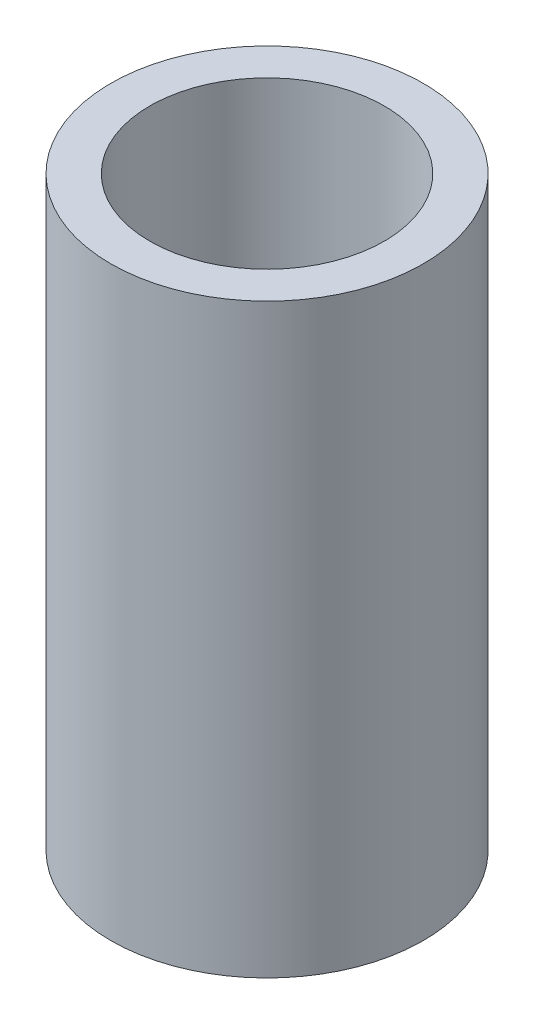
ISO-10303-21;
HEADER;
FILE_DESCRIPTION(('STEP AP214'),'2;1');
FILE_NAME('part.step','',(''),(''),'','','');
FILE_SCHEMA(('AUTOMOTIVE_DESIGN { 1 0 10303 214 1 1 1 1 }'));
ENDSEC;
DATA;
#1=APPLICATION_CONTEXT('core data for automotive mechanical design processes');
#2=APPLICATION_PROTOCOL_DEFINITION('international standard','automotive_design',2000,#1);
#3=PRODUCT_CONTEXT('',#1,'mechanical');
#4=PRODUCT('Part','Part','',(#3));
#5=PRODUCT_RELATED_PRODUCT_CATEGORY('part','',(#4));
#6=PRODUCT_DEFINITION_FORMATION('','',#4);
#7=PRODUCT_DEFINITION_CONTEXT('part definition',#1,'design');
#8=PRODUCT_DEFINITION('design','',#6,#7);
#9=PRODUCT_DEFINITION_SHAPE('','',#8);
#10=(LENGTH_UNIT() NAMED_UNIT(*) SI_UNIT(.MILLI.,.METRE.));
#11=(NAMED_UNIT(*) PLANE_ANGLE_UNIT() SI_UNIT($,.RADIAN.));
#12=(NAMED_UNIT(*) SI_UNIT($,.STERADIAN.) SOLID_ANGLE_UNIT());
#13=UNCERTAINTY_MEASURE_WITH_UNIT(LENGTH_MEASURE(1.E-05),#10,'distance_accuracy_value','');
#14=(GEOMETRIC_REPRESENTATION_CONTEXT(3) GLOBAL_UNCERTAINTY_ASSIGNED_CONTEXT((#13)) GLOBAL_UNIT_ASSIGNED_CONTEXT((#10,
#11,#12)) REPRESENTATION_CONTEXT('',''));
#15=CARTESIAN_POINT('',(0.,0.,0.));
#16=DIRECTION('',(0.,0.,1.));
#17=DIRECTION('',(1.,0.,0.));
#18=AXIS2_PLACEMENT_3D('',#15,#16,#17);
#19=CARTESIAN_POINT('',(0.,15.,0.));
#20=DIRECTION('',(0.,1.,0.));
#21=DIRECTION('',(0.,0.,1.));
#22=AXIS2_PLACEMENT_3D('',#19,#20,#21);
#23=PLANE('',#22);
#24=CARTESIAN_POINT('',(0.,15.,0.));
#25=DIRECTION('',(0.,1.,0.));
#26=DIRECTION('',(0.,0.,1.));
#27=AXIS2_PLACEMENT_3D('',#24,#25,#26);
#28=CIRCLE('',#27,4.);
#29=CARTESIAN_POINT('',(0.,15.,4.));
#30=VERTEX_POINT('',#29);
#31=EDGE_CURVE('E10',#30,#30,#28,.T.);
#32=ORIENTED_EDGE('',*,*,#31,.T.);
#33=EDGE_LOOP('',(#32));
#34=FACE_BOUND('',#33,.T.);
#35=CARTESIAN_POINT('',(0.,15.,0.));
#36=DIRECTION('',(0.,1.,0.));
#37=DIRECTION('',(0.,0.,1.));
#38=AXIS2_PLACEMENT_3D('',#35,#36,#37);
#39=CIRCLE('',#38,3.);
#40=CARTESIAN_POINT('',(0.,15.,3.));
#41=VERTEX_POINT('',#40);
#42=EDGE_CURVE('E44',#41,#41,#39,.T.);
#43=ORIENTED_EDGE('',*,*,#42,.F.);
#44=EDGE_LOOP('',(#43));
#45=FACE_BOUND('',#44,.T.);
#46=ADVANCED_FACE('F33',(#34,#45),#23,.T.);
#47=CARTESIAN_POINT('',(0.,0.,0.));
#48=DIRECTION('',(0.,1.,0.));
#49=DIRECTION('',(0.,0.,1.));
#50=AXIS2_PLACEMENT_3D('',#47,#48,#49);
#51=PLANE('',#50);
#52=CARTESIAN_POINT('',(0.,0.,0.));
#53=DIRECTION('',(0.,1.,0.));
#54=DIRECTION('',(0.,0.,1.));
#55=AXIS2_PLACEMENT_3D('',#52,#53,#54);
#56=CIRCLE('',#55,4.);
#57=CARTESIAN_POINT('',(0.,0.,4.));
#58=VERTEX_POINT('',#57);
#59=EDGE_CURVE('E37',#58,#58,#56,.T.);
#60=ORIENTED_EDGE('',*,*,#59,.F.);
#61=EDGE_LOOP('',(#60));
#62=FACE_BOUND('',#61,.T.);
#63=CARTESIAN_POINT('',(0.,0.,0.));
#64=DIRECTION('',(0.,1.,0.));
#65=DIRECTION('',(0.,0.,1.));
#66=AXIS2_PLACEMENT_3D('',#63,#64,#65);
#67=CIRCLE('',#66,3.);
#68=CARTESIAN_POINT('',(0.,0.,3.));
#69=VERTEX_POINT('',#68);
#70=EDGE_CURVE('E46',#69,#69,#67,.T.);
#71=ORIENTED_EDGE('',*,*,#70,.T.);
#72=EDGE_LOOP('',(#71));
#73=FACE_BOUND('',#72,.T.);
#74=ADVANCED_FACE('F56',(#62,#73),#51,.F.);
#75=CARTESIAN_POINT('',(0.,15.,0.));
#76=DIRECTION('',(0.,-1.,0.));
#77=DIRECTION('',(0.,0.,-1.));
#78=AXIS2_PLACEMENT_3D('',#75,#76,#77);
#79=CYLINDRICAL_SURFACE('',#78,4.);
#80=ORIENTED_EDGE('',*,*,#31,.F.);
#81=EDGE_LOOP('',(#80));
#82=FACE_BOUND('',#81,.T.);
#83=ORIENTED_EDGE('',*,*,#59,.T.);
#84=EDGE_LOOP('',(#83));
#85=FACE_BOUND('',#84,.T.);
#86=ADVANCED_FACE('F35',(#82,#85),#79,.T.);
#87=CARTESIAN_POINT('',(0.,15.,0.));
#88=DIRECTION('',(0.,-1.,0.));
#89=DIRECTION('',(0.,0.,-1.));
#90=AXIS2_PLACEMENT_3D('',#87,#88,#89);
#91=CYLINDRICAL_SURFACE('',#90,3.);
#92=ORIENTED_EDGE('',*,*,#42,.T.);
#93=EDGE_LOOP('',(#92));
#94=FACE_BOUND('',#93,.T.);
#95=ORIENTED_EDGE('',*,*,#70,.F.);
#96=EDGE_LOOP('',(#95));
#97=FACE_BOUND('',#96,.T.);
#98=ADVANCED_FACE('F52',(#94,#97),#91,.F.);
#99=CLOSED_SHELL('',(#46,#74,#86,#98));
#100=MANIFOLD_SOLID_BREP('B2',#99);
#101=ADVANCED_BREP_SHAPE_REPRESENTATION('',(#18,#100),#14);
#102=SHAPE_DEFINITION_REPRESENTATION(#9,#101);
ENDSEC;
END-ISO-10303-21;
